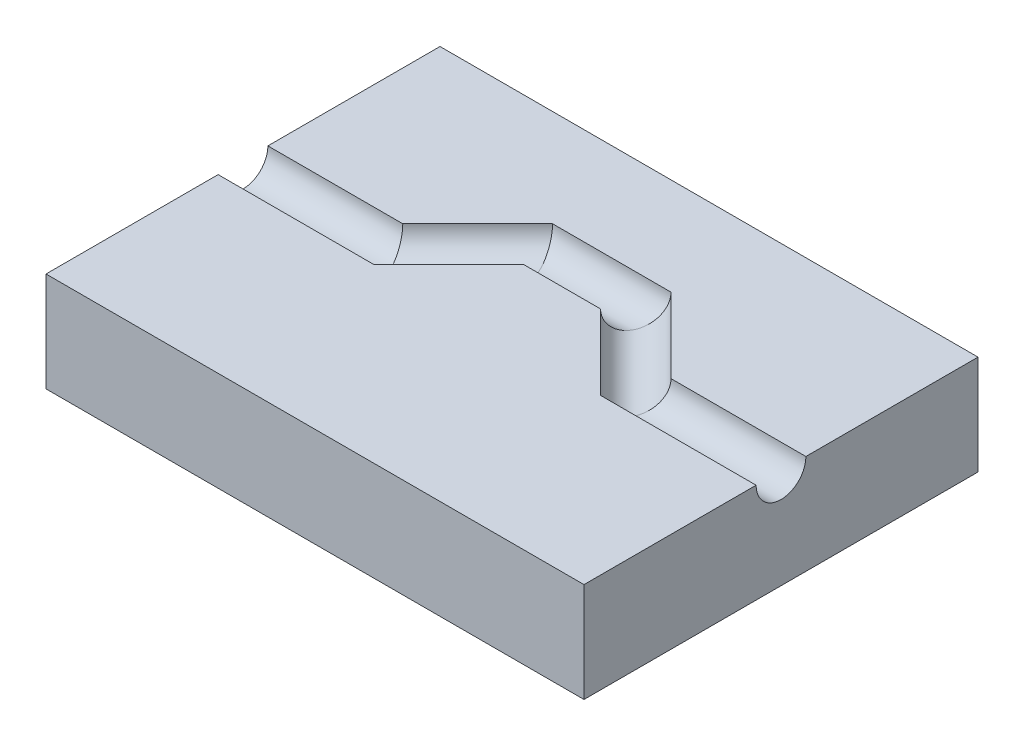
ISO-10303-21;
HEADER;
FILE_DESCRIPTION(('STEP AP214'),'2;1');
FILE_NAME('part.step','',(''),(''),'','','');
FILE_SCHEMA(('AUTOMOTIVE_DESIGN { 1 0 10303 214 1 1 1 1 }'));
ENDSEC;
DATA;
#1=APPLICATION_CONTEXT('core data for automotive mechanical design processes');
#2=APPLICATION_PROTOCOL_DEFINITION('international standard','automotive_design',2000,#1);
#3=PRODUCT_CONTEXT('',#1,'mechanical');
#4=PRODUCT('Part','Part','',(#3));
#5=PRODUCT_RELATED_PRODUCT_CATEGORY('part','',(#4));
#6=PRODUCT_DEFINITION_FORMATION('','',#4);
#7=PRODUCT_DEFINITION_CONTEXT('part definition',#1,'design');
#8=PRODUCT_DEFINITION('design','',#6,#7);
#9=PRODUCT_DEFINITION_SHAPE('','',#8);
#10=(LENGTH_UNIT() NAMED_UNIT(*) SI_UNIT(.MILLI.,.METRE.));
#11=(NAMED_UNIT(*) PLANE_ANGLE_UNIT() SI_UNIT($,.RADIAN.));
#12=(NAMED_UNIT(*) SI_UNIT($,.STERADIAN.) SOLID_ANGLE_UNIT());
#13=UNCERTAINTY_MEASURE_WITH_UNIT(LENGTH_MEASURE(1.E-05),#10,'distance_accuracy_value','');
#14=(GEOMETRIC_REPRESENTATION_CONTEXT(3) GLOBAL_UNCERTAINTY_ASSIGNED_CONTEXT((#13)) GLOBAL_UNIT_ASSIGNED_CONTEXT((#10,
#11,#12)) REPRESENTATION_CONTEXT('',''));
#15=CARTESIAN_POINT('',(0.,0.,0.));
#16=DIRECTION('',(0.,0.,1.));
#17=DIRECTION('',(1.,0.,0.));
#18=AXIS2_PLACEMENT_3D('',#15,#16,#17);
#19=CARTESIAN_POINT('',(54.054627639802,20.,-39.5881037567084));
#20=DIRECTION('',(-1.,0.,0.));
#21=DIRECTION('',(0.,0.,1.));
#22=AXIS2_PLACEMENT_3D('',#19,#20,#21);
#23=PLANE('',#22);
#24=CARTESIAN_POINT('',(54.054627639802,20.,0.));
#25=DIRECTION('',(-1.,0.,0.));
#26=DIRECTION('',(0.,0.,1.));
#27=AXIS2_PLACEMENT_3D('',#24,#25,#26);
#28=CIRCLE('',#27,5.);
#29=CARTESIAN_POINT('',(54.054627639802,20.,5.));
#30=VERTEX_POINT('',#29);
#31=CARTESIAN_POINT('',(54.054627639802,20.,-5.));
#32=VERTEX_POINT('',#31);
#33=EDGE_CURVE('E136',#30,#32,#28,.F.);
#34=ORIENTED_EDGE('',*,*,#33,.F.);
#35=DIRECTION('',(0.,0.,-1.));
#36=VECTOR('',#35,1.);
#37=CARTESIAN_POINT('',(54.054627639802,20.,-39.5881037567084));
#38=LINE('',#37,#36);
#39=CARTESIAN_POINT('',(54.054627639802,20.,39.5881037567084));
#40=VERTEX_POINT('',#39);
#41=EDGE_CURVE('E142',#40,#30,#38,.T.);
#42=ORIENTED_EDGE('',*,*,#41,.F.);
#43=DIRECTION('',(0.,-1.,0.));
#44=VECTOR('',#43,1.);
#45=CARTESIAN_POINT('',(54.054627639802,20.,39.5881037567084));
#46=LINE('',#45,#44);
#47=CARTESIAN_POINT('',(54.054627639802,0.,39.5881037567084));
#48=VERTEX_POINT('',#47);
#49=EDGE_CURVE('E159',#40,#48,#46,.T.);
#50=ORIENTED_EDGE('',*,*,#49,.T.);
#51=DIRECTION('',(0.,0.,-1.));
#52=VECTOR('',#51,1.);
#53=CARTESIAN_POINT('',(54.054627639802,0.,-39.5881037567084));
#54=LINE('',#53,#52);
#55=CARTESIAN_POINT('',(54.054627639802,0.,-39.5881037567084));
#56=VERTEX_POINT('',#55);
#57=EDGE_CURVE('E158',#48,#56,#54,.T.);
#58=ORIENTED_EDGE('',*,*,#57,.T.);
#59=DIRECTION('',(0.,-1.,0.));
#60=VECTOR('',#59,1.);
#61=CARTESIAN_POINT('',(54.054627639802,20.,-39.5881037567084));
#62=LINE('',#61,#60);
#63=CARTESIAN_POINT('',(54.054627639802,20.,-39.5881037567084));
#64=VERTEX_POINT('',#63);
#65=EDGE_CURVE('E137',#64,#56,#62,.T.);
#66=ORIENTED_EDGE('',*,*,#65,.F.);
#67=EDGE_CURVE('E102',#32,#64,#38,.T.);
#68=ORIENTED_EDGE('',*,*,#67,.F.);
#69=EDGE_LOOP('',(#34,#42,#50,#58,#66,#68));
#70=FACE_BOUND('',#69,.T.);
#71=ADVANCED_FACE('F47',(#70),#23,.F.);
#72=CARTESIAN_POINT('',(-54.054627639802,20.,-39.5881037567084));
#73=DIRECTION('',(1.,0.,0.));
#74=DIRECTION('',(0.,0.,-1.));
#75=AXIS2_PLACEMENT_3D('',#72,#73,#74);
#76=PLANE('',#75);
#77=CARTESIAN_POINT('',(-54.054627639802,20.,0.));
#78=DIRECTION('',(1.,0.,0.));
#79=DIRECTION('',(0.,0.,-1.));
#80=AXIS2_PLACEMENT_3D('',#77,#78,#79);
#81=CIRCLE('',#80,5.);
#82=CARTESIAN_POINT('',(-54.054627639802,20.,-5.00000000000001));
#83=VERTEX_POINT('',#82);
#84=CARTESIAN_POINT('',(-54.054627639802,20.,4.99999999999999));
#85=VERTEX_POINT('',#84);
#86=EDGE_CURVE('E144',#83,#85,#81,.F.);
#87=ORIENTED_EDGE('',*,*,#86,.F.);
#88=DIRECTION('',(0.,0.,1.));
#89=VECTOR('',#88,1.);
#90=CARTESIAN_POINT('',(-54.054627639802,20.,-39.5881037567084));
#91=LINE('',#90,#89);
#92=CARTESIAN_POINT('',(-54.054627639802,20.,-39.5881037567084));
#93=VERTEX_POINT('',#92);
#94=EDGE_CURVE('E151',#93,#83,#91,.T.);
#95=ORIENTED_EDGE('',*,*,#94,.F.);
#96=DIRECTION('',(0.,-1.,0.));
#97=VECTOR('',#96,1.);
#98=CARTESIAN_POINT('',(-54.054627639802,20.,-39.5881037567084));
#99=LINE('',#98,#97);
#100=CARTESIAN_POINT('',(-54.054627639802,0.,-39.5881037567084));
#101=VERTEX_POINT('',#100);
#102=EDGE_CURVE('E173',#93,#101,#99,.T.);
#103=ORIENTED_EDGE('',*,*,#102,.T.);
#104=DIRECTION('',(0.,0.,1.));
#105=VECTOR('',#104,1.);
#106=CARTESIAN_POINT('',(-54.054627639802,0.,-39.5881037567084));
#107=LINE('',#106,#105);
#108=CARTESIAN_POINT('',(-54.054627639802,0.,39.5881037567084));
#109=VERTEX_POINT('',#108);
#110=EDGE_CURVE('E161',#101,#109,#107,.T.);
#111=ORIENTED_EDGE('',*,*,#110,.T.);
#112=DIRECTION('',(0.,-1.,0.));
#113=VECTOR('',#112,1.);
#114=CARTESIAN_POINT('',(-54.054627639802,20.,39.5881037567084));
#115=LINE('',#114,#113);
#116=CARTESIAN_POINT('',(-54.054627639802,20.,39.5881037567084));
#117=VERTEX_POINT('',#116);
#118=EDGE_CURVE('E170',#117,#109,#115,.T.);
#119=ORIENTED_EDGE('',*,*,#118,.F.);
#120=EDGE_CURVE('E152',#85,#117,#91,.T.);
#121=ORIENTED_EDGE('',*,*,#120,.F.);
#122=EDGE_LOOP('',(#87,#95,#103,#111,#119,#121));
#123=FACE_BOUND('',#122,.T.);
#124=ADVANCED_FACE('F208',(#123),#76,.F.);
#125=CARTESIAN_POINT('',(0.,20.,0.));
#126=DIRECTION('',(0.,1.,0.));
#127=DIRECTION('',(0.,0.,1.));
#128=AXIS2_PLACEMENT_3D('',#125,#126,#127);
#129=PLANE('',#128);
#130=DIRECTION('',(-1.,0.,0.));
#131=VECTOR('',#130,1.);
#132=CARTESIAN_POINT('',(-22.5002485250925,20.,-5.00000000000001));
#133=LINE('',#132,#131);
#134=CARTESIAN_POINT('',(-26.94949093001,20.,-5.00000000000001));
#135=VERTEX_POINT('',#134);
#136=EDGE_CURVE('E12',#135,#83,#133,.T.);
#137=ORIENTED_EDGE('',*,*,#136,.F.);
#138=DIRECTION('',(-0.707106781186546,0.,0.707106781186549));
#139=VECTOR('',#138,1.);
#140=CARTESIAN_POINT('',(-11.6841488725208,20.,-20.2653420574893));
#141=LINE('',#140,#139);
#142=CARTESIAN_POINT('',(-11.9013061600462,20.,-20.0481847699639));
#143=VERTEX_POINT('',#142);
#144=EDGE_CURVE('E57',#143,#135,#141,.T.);
#145=ORIENTED_EDGE('',*,*,#144,.F.);
#146=DIRECTION('',(-1.,0.,0.));
#147=VECTOR('',#146,1.);
#148=CARTESIAN_POINT('',(12.2084129412327,20.,-20.0481847699639));
#149=LINE('',#148,#147);
#150=CARTESIAN_POINT('',(11.9013061600462,20.,-20.0481847699639));
#151=VERTEX_POINT('',#150);
#152=EDGE_CURVE('E190',#151,#143,#149,.T.);
#153=ORIENTED_EDGE('',*,*,#152,.F.);
#154=DIRECTION('',(-0.707106781186546,0.,-0.707106781186549));
#155=VECTOR('',#154,1.);
#156=CARTESIAN_POINT('',(30.09558040567,20.,-1.85391052434008));
#157=LINE('',#156,#155);
#158=CARTESIAN_POINT('',(26.94949093001,20.,-5.));
#159=VERTEX_POINT('',#158);
#160=EDGE_CURVE('E184',#159,#151,#157,.T.);
#161=ORIENTED_EDGE('',*,*,#160,.F.);
#162=DIRECTION('',(-1.,0.,0.));
#163=VECTOR('',#162,1.);
#164=CARTESIAN_POINT('',(58.054627639802,20.,-5.));
#165=LINE('',#164,#163);
#166=EDGE_CURVE('E183',#32,#159,#165,.T.);
#167=ORIENTED_EDGE('',*,*,#166,.F.);
#168=ORIENTED_EDGE('',*,*,#67,.T.);
#169=DIRECTION('',(-1.,0.,0.));
#170=VECTOR('',#169,1.);
#171=CARTESIAN_POINT('',(-54.054627639802,20.,-39.5881037567084));
#172=LINE('',#171,#170);
#173=EDGE_CURVE('E146',#64,#93,#172,.T.);
#174=ORIENTED_EDGE('',*,*,#173,.T.);
#175=ORIENTED_EDGE('',*,*,#94,.T.);
#176=EDGE_LOOP('',(#137,#145,#153,#161,#167,#168,#174,#175));
#177=FACE_BOUND('',#176,.T.);
#178=ADVANCED_FACE('F204',(#177),#129,.T.);
#179=CARTESIAN_POINT('',(-54.054627639802,20.,-39.5881037567084));
#180=DIRECTION('',(0.,0.,1.));
#181=DIRECTION('',(1.,0.,0.));
#182=AXIS2_PLACEMENT_3D('',#179,#180,#181);
#183=PLANE('',#182);
#184=DIRECTION('',(-1.,0.,0.));
#185=VECTOR('',#184,1.);
#186=CARTESIAN_POINT('',(-54.054627639802,0.,-39.5881037567084));
#187=LINE('',#186,#185);
#188=EDGE_CURVE('E163',#56,#101,#187,.T.);
#189=ORIENTED_EDGE('',*,*,#188,.T.);
#190=ORIENTED_EDGE('',*,*,#102,.F.);
#191=ORIENTED_EDGE('',*,*,#173,.F.);
#192=ORIENTED_EDGE('',*,*,#65,.T.);
#193=EDGE_LOOP('',(#189,#190,#191,#192));
#194=FACE_BOUND('',#193,.T.);
#195=ADVANCED_FACE('F245',(#194),#183,.F.);
#196=CARTESIAN_POINT('',(-54.054627639802,20.,39.5881037567084));
#197=DIRECTION('',(0.,0.,-1.));
#198=DIRECTION('',(-1.,0.,0.));
#199=AXIS2_PLACEMENT_3D('',#196,#197,#198);
#200=PLANE('',#199);
#201=DIRECTION('',(1.,0.,0.));
#202=VECTOR('',#201,1.);
#203=CARTESIAN_POINT('',(-54.054627639802,0.,39.5881037567084));
#204=LINE('',#203,#202);
#205=EDGE_CURVE('E93',#109,#48,#204,.T.);
#206=ORIENTED_EDGE('',*,*,#205,.T.);
#207=ORIENTED_EDGE('',*,*,#49,.F.);
#208=DIRECTION('',(1.,0.,0.));
#209=VECTOR('',#208,1.);
#210=CARTESIAN_POINT('',(-54.054627639802,20.,39.5881037567084));
#211=LINE('',#210,#209);
#212=EDGE_CURVE('E75',#117,#40,#211,.T.);
#213=ORIENTED_EDGE('',*,*,#212,.F.);
#214=ORIENTED_EDGE('',*,*,#118,.T.);
#215=EDGE_LOOP('',(#206,#207,#213,#214));
#216=FACE_BOUND('',#215,.T.);
#217=ADVANCED_FACE('F241',(#216),#200,.F.);
#218=DIRECTION('',(-1.,0.,0.));
#219=VECTOR('',#218,1.);
#220=CARTESIAN_POINT('',(-22.5002485250925,20.,4.99999999999999));
#221=LINE('',#220,#219);
#222=CARTESIAN_POINT('',(-22.8073553062791,20.,4.99999999999999));
#223=VERTEX_POINT('',#222);
#224=EDGE_CURVE('E181',#85,#223,#221,.F.);
#225=ORIENTED_EDGE('',*,*,#224,.F.);
#226=ORIENTED_EDGE('',*,*,#120,.T.);
#227=ORIENTED_EDGE('',*,*,#212,.T.);
#228=ORIENTED_EDGE('',*,*,#41,.T.);
#229=DIRECTION('',(-1.,0.,0.));
#230=VECTOR('',#229,1.);
#231=CARTESIAN_POINT('',(58.054627639802,20.,5.));
#232=LINE('',#231,#230);
#233=CARTESIAN_POINT('',(22.8073553062791,20.,5.));
#234=VERTEX_POINT('',#233);
#235=EDGE_CURVE('E133',#234,#30,#232,.F.);
#236=ORIENTED_EDGE('',*,*,#235,.F.);
#237=DIRECTION('',(-0.707106781186546,0.,-0.707106781186549));
#238=VECTOR('',#237,1.);
#239=CARTESIAN_POINT('',(23.0245125938045,20.,5.21715728752539));
#240=LINE('',#239,#238);
#241=CARTESIAN_POINT('',(7.75917053631522,20.,-10.0481847699639));
#242=VERTEX_POINT('',#241);
#243=EDGE_CURVE('E138',#242,#234,#240,.F.);
#244=ORIENTED_EDGE('',*,*,#243,.F.);
#245=DIRECTION('',(-1.,0.,0.));
#246=VECTOR('',#245,1.);
#247=CARTESIAN_POINT('',(12.2084129412327,20.,-10.0481847699639));
#248=LINE('',#247,#246);
#249=CARTESIAN_POINT('',(-7.75917053631523,20.,-10.0481847699639));
#250=VERTEX_POINT('',#249);
#251=EDGE_CURVE('E180',#250,#242,#248,.F.);
#252=ORIENTED_EDGE('',*,*,#251,.F.);
#253=DIRECTION('',(-0.707106781186546,0.,0.707106781186549));
#254=VECTOR('',#253,1.);
#255=CARTESIAN_POINT('',(-4.61308106065531,20.,-13.1942742456238));
#256=LINE('',#255,#254);
#257=EDGE_CURVE('E177',#223,#250,#256,.F.);
#258=ORIENTED_EDGE('',*,*,#257,.F.);
#259=EDGE_LOOP('',(#225,#226,#227,#228,#236,#244,#252,#258));
#260=FACE_BOUND('',#259,.T.);
#261=ADVANCED_FACE('F149',(#260),#129,.T.);
#262=CARTESIAN_POINT('',(0.,0.,0.));
#263=DIRECTION('',(0.,1.,0.));
#264=DIRECTION('',(0.,0.,1.));
#265=AXIS2_PLACEMENT_3D('',#262,#263,#264);
#266=PLANE('',#265);
#267=ORIENTED_EDGE('',*,*,#57,.F.);
#268=ORIENTED_EDGE('',*,*,#205,.F.);
#269=ORIENTED_EDGE('',*,*,#110,.F.);
#270=ORIENTED_EDGE('',*,*,#188,.F.);
#271=EDGE_LOOP('',(#267,#268,#269,#270));
#272=FACE_BOUND('',#271,.T.);
#273=ADVANCED_FACE('F231',(#272),#266,.F.);
#274=CARTESIAN_POINT('',(-22.5002485250925,20.,0.));
#275=DIRECTION('',(-1.,0.,0.));
#276=DIRECTION('',(0.,0.,1.));
#277=AXIS2_PLACEMENT_3D('',#274,#275,#276);
#278=CYLINDRICAL_SURFACE('',#277,5.);
#279=ORIENTED_EDGE('',*,*,#136,.T.);
#280=ORIENTED_EDGE('',*,*,#86,.T.);
#281=ORIENTED_EDGE('',*,*,#224,.T.);
#282=CARTESIAN_POINT('',(-24.8784231181446,20.,0.));
#283=DIRECTION('',(-0.923879532511286,0.,0.382683432365091));
#284=DIRECTION('',(0.382683432365091,0.,0.923879532511287));
#285=AXIS2_PLACEMENT_3D('',#282,#283,#284);
#286=ELLIPSE('',#285,5.41196100146197,5.);
#287=EDGE_CURVE('E191',#223,#135,#286,.F.);
#288=ORIENTED_EDGE('',*,*,#287,.T.);
#289=EDGE_LOOP('',(#279,#280,#281,#288));
#290=FACE_BOUND('',#289,.T.);
#291=ADVANCED_FACE('F202',(#290),#278,.F.);
#292=CARTESIAN_POINT('',(-8.14861496658806,20.,-16.7298081515566));
#293=DIRECTION('',(-0.707106781186546,0.,0.707106781186549));
#294=DIRECTION('',(0.707106781186549,0.,0.707106781186546));
#295=AXIS2_PLACEMENT_3D('',#292,#293,#294);
#296=CYLINDRICAL_SURFACE('',#295,5.);
#297=ORIENTED_EDGE('',*,*,#144,.T.);
#298=ORIENTED_EDGE('',*,*,#287,.F.);
#299=ORIENTED_EDGE('',*,*,#257,.T.);
#300=CARTESIAN_POINT('',(-9.83023834818071,20.,-15.0481847699639));
#301=DIRECTION('',(-0.923879532511286,0.,0.38268343236509));
#302=DIRECTION('',(-0.382683432365091,0.,-0.923879532511287));
#303=AXIS2_PLACEMENT_3D('',#300,#301,#302);
#304=ELLIPSE('',#303,5.41196100146197,5.);
#305=EDGE_CURVE('E200',#250,#143,#304,.F.);
#306=ORIENTED_EDGE('',*,*,#305,.T.);
#307=EDGE_LOOP('',(#297,#298,#299,#306));
#308=FACE_BOUND('',#307,.T.);
#309=ADVANCED_FACE('F194',(#308),#296,.F.);
#310=CARTESIAN_POINT('',(12.2084129412327,20.,-15.0481847699639));
#311=DIRECTION('',(-1.,0.,0.));
#312=DIRECTION('',(0.,0.,1.));
#313=AXIS2_PLACEMENT_3D('',#310,#311,#312);
#314=CYLINDRICAL_SURFACE('',#313,5.);
#315=ORIENTED_EDGE('',*,*,#152,.T.);
#316=ORIENTED_EDGE('',*,*,#305,.F.);
#317=ORIENTED_EDGE('',*,*,#251,.T.);
#318=CARTESIAN_POINT('',(9.83023834818071,20.,-15.0481847699639));
#319=DIRECTION('',(-0.923879532511286,0.,-0.382683432365091));
#320=DIRECTION('',(0.382683432365091,0.,-0.923879532511287));
#321=AXIS2_PLACEMENT_3D('',#318,#319,#320);
#322=ELLIPSE('',#321,5.41196100146197,5.);
#323=EDGE_CURVE('E220',#242,#151,#322,.F.);
#324=ORIENTED_EDGE('',*,*,#323,.T.);
#325=EDGE_LOOP('',(#315,#316,#317,#324));
#326=FACE_BOUND('',#325,.T.);
#327=ADVANCED_FACE('F215',(#326),#314,.F.);
#328=CARTESIAN_POINT('',(26.5600464997372,20.,1.68162338159265));
#329=DIRECTION('',(-0.707106781186546,0.,-0.707106781186549));
#330=DIRECTION('',(-0.707106781186549,0.,0.707106781186546));
#331=AXIS2_PLACEMENT_3D('',#328,#329,#330);
#332=CYLINDRICAL_SURFACE('',#331,5.);
#333=ORIENTED_EDGE('',*,*,#160,.T.);
#334=ORIENTED_EDGE('',*,*,#323,.F.);
#335=ORIENTED_EDGE('',*,*,#243,.T.);
#336=CARTESIAN_POINT('',(24.8784231181446,20.,0.));
#337=DIRECTION('',(-0.923879532511286,0.,-0.382683432365091));
#338=DIRECTION('',(-0.382683432365091,0.,0.923879532511287));
#339=AXIS2_PLACEMENT_3D('',#336,#337,#338);
#340=ELLIPSE('',#339,5.41196100146197,5.);
#341=EDGE_CURVE('E63',#234,#159,#340,.F.);
#342=ORIENTED_EDGE('',*,*,#341,.T.);
#343=EDGE_LOOP('',(#333,#334,#335,#342));
#344=FACE_BOUND('',#343,.T.);
#345=ADVANCED_FACE('F223',(#344),#332,.F.);
#346=CARTESIAN_POINT('',(58.054627639802,20.,0.));
#347=DIRECTION('',(-1.,0.,0.));
#348=DIRECTION('',(0.,0.,1.));
#349=AXIS2_PLACEMENT_3D('',#346,#347,#348);
#350=CYLINDRICAL_SURFACE('',#349,5.);
#351=ORIENTED_EDGE('',*,*,#166,.T.);
#352=ORIENTED_EDGE('',*,*,#341,.F.);
#353=ORIENTED_EDGE('',*,*,#235,.T.);
#354=ORIENTED_EDGE('',*,*,#33,.T.);
#355=EDGE_LOOP('',(#351,#352,#353,#354));
#356=FACE_BOUND('',#355,.T.);
#357=ADVANCED_FACE('F134',(#356),#350,.F.);
#358=CLOSED_SHELL('',(#71,#124,#178,#195,#217,#261,#273,#291,#309,#327,#345,#357));
#359=MANIFOLD_SOLID_BREP('B2',#358);
#360=ADVANCED_BREP_SHAPE_REPRESENTATION('',(#18,#359),#14);
#361=SHAPE_DEFINITION_REPRESENTATION(#9,#360);
ENDSEC;
END-ISO-10303-21;
